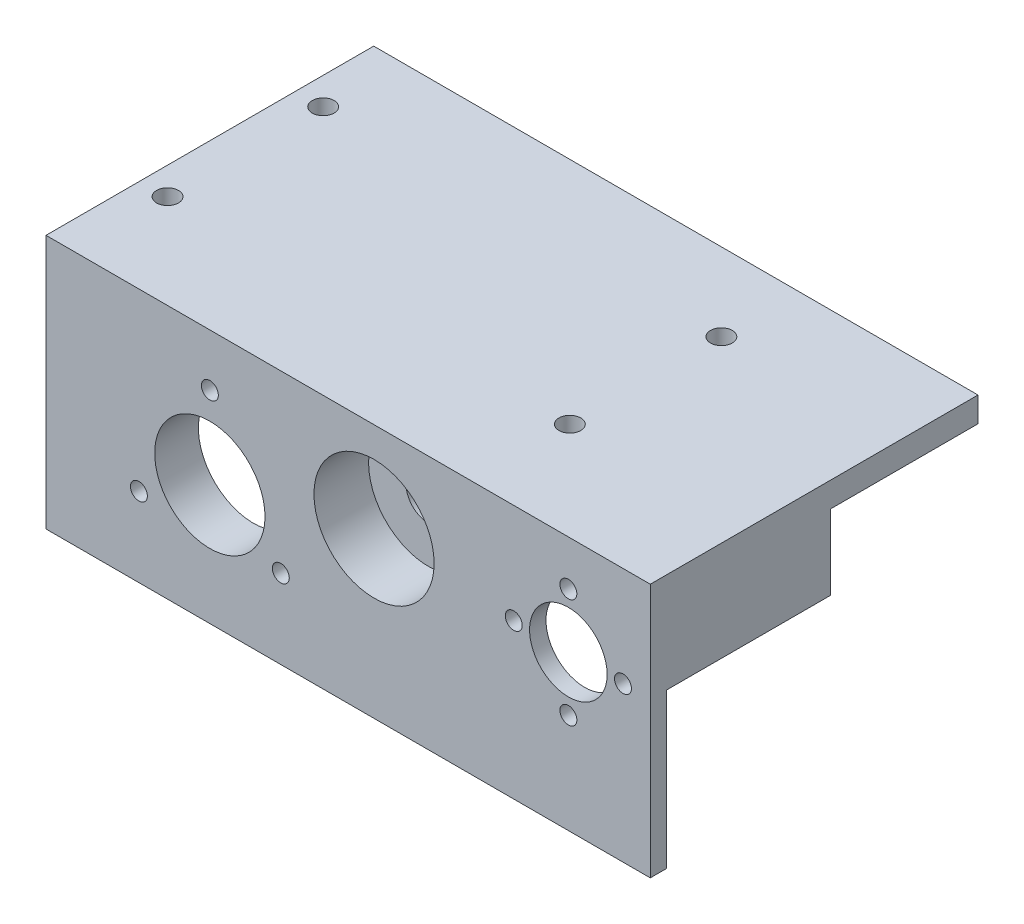
ISO-10303-21;
HEADER;
FILE_DESCRIPTION(('STEP AP214'),'2;1');
FILE_NAME('part.step','',(''),(''),'','','');
FILE_SCHEMA(('AUTOMOTIVE_DESIGN { 1 0 10303 214 1 1 1 1 }'));
ENDSEC;
DATA;
#1=APPLICATION_CONTEXT('core data for automotive mechanical design processes');
#2=APPLICATION_PROTOCOL_DEFINITION('international standard','automotive_design',2000,#1);
#3=PRODUCT_CONTEXT('',#1,'mechanical');
#4=PRODUCT('Part','Part','',(#3));
#5=PRODUCT_RELATED_PRODUCT_CATEGORY('part','',(#4));
#6=PRODUCT_DEFINITION_FORMATION('','',#4);
#7=PRODUCT_DEFINITION_CONTEXT('part definition',#1,'design');
#8=PRODUCT_DEFINITION('design','',#6,#7);
#9=PRODUCT_DEFINITION_SHAPE('','',#8);
#10=(LENGTH_UNIT() NAMED_UNIT(*) SI_UNIT(.MILLI.,.METRE.));
#11=(NAMED_UNIT(*) PLANE_ANGLE_UNIT() SI_UNIT($,.RADIAN.));
#12=(NAMED_UNIT(*) SI_UNIT($,.STERADIAN.) SOLID_ANGLE_UNIT());
#13=UNCERTAINTY_MEASURE_WITH_UNIT(LENGTH_MEASURE(1.E-05),#10,'distance_accuracy_value','');
#14=(GEOMETRIC_REPRESENTATION_CONTEXT(3) GLOBAL_UNCERTAINTY_ASSIGNED_CONTEXT((#13)) GLOBAL_UNIT_ASSIGNED_CONTEXT((#10,
#11,#12)) REPRESENTATION_CONTEXT('',''));
#15=CARTESIAN_POINT('',(0.,0.,0.));
#16=DIRECTION('',(0.,0.,1.));
#17=DIRECTION('',(1.,0.,0.));
#18=AXIS2_PLACEMENT_3D('',#15,#16,#17);
#19=CARTESIAN_POINT('',(60.0592660438776,30.0711771696162,60.));
#20=DIRECTION('',(0.,0.,-1.));
#21=DIRECTION('',(-1.,0.,0.));
#22=AXIS2_PLACEMENT_3D('',#19,#20,#21);
#23=CYLINDRICAL_SURFACE('',#22,11.);
#24=CARTESIAN_POINT('',(60.0592660438776,30.0711771696162,-7.00000000000001));
#25=DIRECTION('',(0.,0.,-1.));
#26=DIRECTION('',(-1.,0.,0.));
#27=AXIS2_PLACEMENT_3D('',#24,#25,#26);
#28=CIRCLE('',#27,11.);
#29=CARTESIAN_POINT('',(49.0592660438776,30.0711771696162,-7.00000000000001));
#30=VERTEX_POINT('',#29);
#31=EDGE_CURVE('E301',#30,#30,#28,.F.);
#32=ORIENTED_EDGE('',*,*,#31,.F.);
#33=EDGE_LOOP('',(#32));
#34=FACE_BOUND('',#33,.T.);
#35=CARTESIAN_POINT('',(60.0592660438776,30.0711771696162,3.));
#36=DIRECTION('',(0.,0.,1.));
#37=DIRECTION('',(1.,0.,0.));
#38=AXIS2_PLACEMENT_3D('',#35,#36,#37);
#39=CIRCLE('',#38,11.);
#40=CARTESIAN_POINT('',(71.0592660438776,30.0711771696162,3.));
#41=VERTEX_POINT('',#40);
#42=EDGE_CURVE('E321',#41,#41,#39,.T.);
#43=ORIENTED_EDGE('',*,*,#42,.T.);
#44=EDGE_LOOP('',(#43));
#45=FACE_BOUND('',#44,.T.);
#46=ADVANCED_FACE('F82',(#34,#45),#23,.F.);
#47=CARTESIAN_POINT('',(60.0592660438776,30.0711771696162,-7.));
#48=DIRECTION('',(0.,0.,1.));
#49=DIRECTION('',(1.,0.,0.));
#50=AXIS2_PLACEMENT_3D('',#47,#48,#49);
#51=CYLINDRICAL_SURFACE('',#50,13.);
#52=CARTESIAN_POINT('',(60.0592660438776,30.0711771696162,0.));
#53=DIRECTION('',(0.,0.,-1.));
#54=DIRECTION('',(-1.,0.,0.));
#55=AXIS2_PLACEMENT_3D('',#52,#53,#54);
#56=CIRCLE('',#55,13.);
#57=CARTESIAN_POINT('',(73.0592660438776,30.0711771696162,0.));
#58=VERTEX_POINT('',#57);
#59=CARTESIAN_POINT('',(55.9092660438776,17.7513760348575,0.));
#60=VERTEX_POINT('',#59);
#61=EDGE_CURVE('E311',#58,#60,#56,.T.);
#62=ORIENTED_EDGE('',*,*,#61,.T.);
#63=DIRECTION('',(0.,0.,1.));
#64=VECTOR('',#63,1.);
#65=CARTESIAN_POINT('',(55.9092660438776,17.7513760348575,-7.));
#66=LINE('',#65,#64);
#67=CARTESIAN_POINT('',(55.9092660438776,17.7513760348575,-5.));
#68=VERTEX_POINT('',#67);
#69=EDGE_CURVE('E100',#60,#68,#66,.F.);
#70=ORIENTED_EDGE('',*,*,#69,.T.);
#71=CARTESIAN_POINT('',(60.0592660438776,30.0711771696162,-5.));
#72=DIRECTION('',(0.,0.,-1.));
#73=DIRECTION('',(-1.,0.,0.));
#74=AXIS2_PLACEMENT_3D('',#71,#72,#73);
#75=CIRCLE('',#74,13.);
#76=CARTESIAN_POINT('',(49.5967813175664,22.3551928933423,-5.));
#77=VERTEX_POINT('',#76);
#78=EDGE_CURVE('E202',#68,#77,#75,.T.);
#79=ORIENTED_EDGE('',*,*,#78,.T.);
#80=DIRECTION('',(0.,0.,1.));
#81=VECTOR('',#80,1.);
#82=CARTESIAN_POINT('',(49.5967813175664,22.3551928933423,-28.5));
#83=LINE('',#82,#81);
#84=CARTESIAN_POINT('',(49.5967813175664,22.3551928933423,-30.));
#85=VERTEX_POINT('',#84);
#86=EDGE_CURVE('E278',#85,#77,#83,.T.);
#87=ORIENTED_EDGE('',*,*,#86,.F.);
#88=CARTESIAN_POINT('',(60.0592660438776,30.0711771696162,-30.));
#89=DIRECTION('',(0.,0.,-1.));
#90=DIRECTION('',(-1.,0.,0.));
#91=AXIS2_PLACEMENT_3D('',#88,#89,#90);
#92=CIRCLE('',#91,13.);
#93=CARTESIAN_POINT('',(73.0592660438776,30.0711771696162,-30.));
#94=VERTEX_POINT('',#93);
#95=EDGE_CURVE('E288',#94,#85,#92,.T.);
#96=ORIENTED_EDGE('',*,*,#95,.F.);
#97=DIRECTION('',(0.,0.,1.));
#98=VECTOR('',#97,1.);
#99=CARTESIAN_POINT('',(73.0592660438776,30.0711771696162,-7.));
#100=LINE('',#99,#98);
#101=EDGE_CURVE('E318',#94,#58,#100,.T.);
#102=ORIENTED_EDGE('',*,*,#101,.T.);
#103=EDGE_LOOP('',(#62,#70,#79,#87,#96,#102));
#104=FACE_BOUND('',#103,.T.);
#105=ADVANCED_FACE('F497',(#104),#51,.T.);
#106=CARTESIAN_POINT('',(47.0592660438776,0.,-7.));
#107=DIRECTION('',(-1.,0.,0.));
#108=DIRECTION('',(0.,0.,1.));
#109=AXIS2_PLACEMENT_3D('',#106,#107,#108);
#110=PLANE('',#109);
#111=DIRECTION('',(0.,-1.,0.));
#112=VECTOR('',#111,1.);
#113=CARTESIAN_POINT('',(47.0592660438776,0.,-5.));
#114=LINE('',#113,#112);
#115=CARTESIAN_POINT('',(47.0592660438776,42.,-5.));
#116=VERTEX_POINT('',#115);
#117=CARTESIAN_POINT('',(47.0592660438776,31.650981403164,-5.));
#118=VERTEX_POINT('',#117);
#119=EDGE_CURVE('E226',#116,#118,#114,.T.);
#120=ORIENTED_EDGE('',*,*,#119,.F.);
#121=DIRECTION('',(0.,0.,1.));
#122=VECTOR('',#121,1.);
#123=CARTESIAN_POINT('',(47.0592660438776,42.,-7.));
#124=LINE('',#123,#122);
#125=CARTESIAN_POINT('',(47.0592660438776,42.,-30.));
#126=VERTEX_POINT('',#125);
#127=EDGE_CURVE('E314',#126,#116,#124,.T.);
#128=ORIENTED_EDGE('',*,*,#127,.F.);
#129=DIRECTION('',(0.,1.,0.));
#130=VECTOR('',#129,1.);
#131=CARTESIAN_POINT('',(47.0592660438776,30.0711771696162,-30.));
#132=LINE('',#131,#130);
#133=CARTESIAN_POINT('',(47.0592660438776,31.650981403164,-30.));
#134=VERTEX_POINT('',#133);
#135=EDGE_CURVE('E285',#134,#126,#132,.T.);
#136=ORIENTED_EDGE('',*,*,#135,.F.);
#137=DIRECTION('',(0.,0.,1.));
#138=VECTOR('',#137,1.);
#139=CARTESIAN_POINT('',(47.0592660438776,31.650981403164,-57.));
#140=LINE('',#139,#138);
#141=EDGE_CURVE('E12',#134,#118,#140,.T.);
#142=ORIENTED_EDGE('',*,*,#141,.T.);
#143=EDGE_LOOP('',(#120,#128,#136,#142));
#144=FACE_BOUND('',#143,.T.);
#145=ADVANCED_FACE('F504',(#144),#110,.T.);
#146=CARTESIAN_POINT('',(60.0592660438776,30.0711771696162,-23.));
#147=DIRECTION('',(0.,0.,-1.));
#148=DIRECTION('',(-1.,0.,0.));
#149=AXIS2_PLACEMENT_3D('',#146,#147,#148);
#150=PLANE('',#149);
#151=CARTESIAN_POINT('',(60.0592660438776,30.0711771696162,-23.));
#152=DIRECTION('',(0.,0.,-1.));
#153=DIRECTION('',(-1.,0.,0.));
#154=AXIS2_PLACEMENT_3D('',#151,#152,#153);
#155=CIRCLE('',#154,4.15);
#156=CARTESIAN_POINT('',(55.9092660438776,30.0711771696162,-23.));
#157=VERTEX_POINT('',#156);
#158=EDGE_CURVE('E297',#157,#157,#155,.T.);
#159=ORIENTED_EDGE('',*,*,#158,.F.);
#160=EDGE_LOOP('',(#159));
#161=FACE_BOUND('',#160,.T.);
#162=CARTESIAN_POINT('',(60.0592660438776,30.0711771696162,-23.));
#163=DIRECTION('',(0.,0.,-1.));
#164=DIRECTION('',(-1.,0.,0.));
#165=AXIS2_PLACEMENT_3D('',#162,#163,#164);
#166=CIRCLE('',#165,11.);
#167=CARTESIAN_POINT('',(49.0592660438776,30.0711771696162,-23.));
#168=VERTEX_POINT('',#167);
#169=EDGE_CURVE('E92',#168,#168,#166,.F.);
#170=ORIENTED_EDGE('',*,*,#169,.F.);
#171=EDGE_LOOP('',(#170));
#172=FACE_BOUND('',#171,.T.);
#173=ADVANCED_FACE('F542',(#161,#172),#150,.T.);
#174=CARTESIAN_POINT('',(0.,0.,0.));
#175=DIRECTION('',(0.,0.,1.));
#176=DIRECTION('',(1.,0.,0.));
#177=AXIS2_PLACEMENT_3D('',#174,#175,#176);
#178=PLANE('',#177);
#179=DIRECTION('',(1.,0.,0.));
#180=VECTOR('',#179,1.);
#181=CARTESIAN_POINT('',(0.,0.,0.));
#182=LINE('',#181,#180);
#183=CARTESIAN_POINT('',(55.9092660438776,0.,0.));
#184=VERTEX_POINT('',#183);
#185=CARTESIAN_POINT('',(110.639208531659,0.,0.));
#186=VERTEX_POINT('',#185);
#187=EDGE_CURVE('E452',#184,#186,#182,.T.);
#188=ORIENTED_EDGE('',*,*,#187,.F.);
#189=DIRECTION('',(0.,-1.,0.));
#190=VECTOR('',#189,1.);
#191=CARTESIAN_POINT('',(55.9092660438776,0.,0.));
#192=LINE('',#191,#190);
#193=EDGE_CURVE('E108',#60,#184,#192,.T.);
#194=ORIENTED_EDGE('',*,*,#193,.F.);
#195=ORIENTED_EDGE('',*,*,#61,.F.);
#196=DIRECTION('',(1.,0.,0.));
#197=VECTOR('',#196,1.);
#198=CARTESIAN_POINT('',(0.,30.0711771696162,0.));
#199=LINE('',#198,#197);
#200=CARTESIAN_POINT('',(82.760430195426,30.0711771696162,0.));
#201=VERTEX_POINT('',#200);
#202=EDGE_CURVE('E308',#58,#201,#199,.T.);
#203=ORIENTED_EDGE('',*,*,#202,.T.);
#204=CARTESIAN_POINT('',(95.6392085316593,28.2999999999999,0.));
#205=DIRECTION('',(0.,0.,1.));
#206=DIRECTION('',(1.,0.,0.));
#207=AXIS2_PLACEMENT_3D('',#204,#205,#206);
#208=CIRCLE('',#207,13.);
#209=CARTESIAN_POINT('',(108.639208531659,28.2999999999964,0.));
#210=VERTEX_POINT('',#209);
#211=EDGE_CURVE('E338',#210,#201,#208,.T.);
#212=ORIENTED_EDGE('',*,*,#211,.F.);
#213=DIRECTION('',(-1.,0.,0.));
#214=VECTOR('',#213,1.);
#215=CARTESIAN_POINT('',(0.,28.2999999999964,0.));
#216=LINE('',#215,#214);
#217=CARTESIAN_POINT('',(110.639208531659,28.2999999999964,0.));
#218=VERTEX_POINT('',#217);
#219=EDGE_CURVE('E327',#218,#210,#216,.T.);
#220=ORIENTED_EDGE('',*,*,#219,.F.);
#221=DIRECTION('',(0.,-1.,0.));
#222=VECTOR('',#221,1.);
#223=CARTESIAN_POINT('',(110.639208531659,0.,0.));
#224=LINE('',#223,#222);
#225=EDGE_CURVE('E448',#218,#186,#224,.T.);
#226=ORIENTED_EDGE('',*,*,#225,.T.);
#227=EDGE_LOOP('',(#188,#194,#195,#203,#212,#220,#226));
#228=FACE_BOUND('',#227,.T.);
#229=CARTESIAN_POINT('',(85.6392085316545,28.2999999999964,0.));
#230=DIRECTION('',(0.,0.,1.));
#231=DIRECTION('',(1.,0.,0.));
#232=AXIS2_PLACEMENT_3D('',#229,#230,#231);
#233=CIRCLE('',#232,1.54999999999999);
#234=CARTESIAN_POINT('',(87.1892085316545,28.2999999999964,0.));
#235=VERTEX_POINT('',#234);
#236=EDGE_CURVE('E444',#235,#235,#233,.T.);
#237=ORIENTED_EDGE('',*,*,#236,.T.);
#238=EDGE_LOOP('',(#237));
#239=FACE_BOUND('',#238,.T.);
#240=CARTESIAN_POINT('',(95.6392085316592,38.3000000000002,0.));
#241=DIRECTION('',(0.,0.,1.));
#242=DIRECTION('',(1.,0.,0.));
#243=AXIS2_PLACEMENT_3D('',#240,#241,#242);
#244=CIRCLE('',#243,1.54999999999999);
#245=CARTESIAN_POINT('',(97.1892085316592,38.3000000000002,0.));
#246=VERTEX_POINT('',#245);
#247=EDGE_CURVE('E384',#246,#246,#244,.T.);
#248=ORIENTED_EDGE('',*,*,#247,.T.);
#249=EDGE_LOOP('',(#248));
#250=FACE_BOUND('',#249,.T.);
#251=CARTESIAN_POINT('',(105.639208531663,28.2999999999955,0.));
#252=DIRECTION('',(0.,0.,1.));
#253=DIRECTION('',(1.,0.,0.));
#254=AXIS2_PLACEMENT_3D('',#251,#252,#253);
#255=CIRCLE('',#254,1.54999999999999);
#256=CARTESIAN_POINT('',(107.189208531663,28.2999999999955,0.));
#257=VERTEX_POINT('',#256);
#258=EDGE_CURVE('E436',#257,#257,#255,.T.);
#259=ORIENTED_EDGE('',*,*,#258,.T.);
#260=EDGE_LOOP('',(#259));
#261=FACE_BOUND('',#260,.T.);
#262=CARTESIAN_POINT('',(95.6392085316593,28.2999999999999,0.));
#263=DIRECTION('',(0.,0.,1.));
#264=DIRECTION('',(1.,0.,0.));
#265=AXIS2_PLACEMENT_3D('',#262,#263,#264);
#266=CIRCLE('',#265,7.09999999999999);
#267=CARTESIAN_POINT('',(102.739208531659,28.2999999999999,0.));
#268=VERTEX_POINT('',#267);
#269=EDGE_CURVE('E440',#268,#268,#266,.T.);
#270=ORIENTED_EDGE('',*,*,#269,.T.);
#271=EDGE_LOOP('',(#270));
#272=FACE_BOUND('',#271,.T.);
#273=CARTESIAN_POINT('',(95.6392085316584,18.2999999999916,0.));
#274=DIRECTION('',(0.,0.,1.));
#275=DIRECTION('',(1.,0.,0.));
#276=AXIS2_PLACEMENT_3D('',#273,#274,#275);
#277=CIRCLE('',#276,1.54999999999999);
#278=CARTESIAN_POINT('',(97.1892085316584,18.2999999999916,0.));
#279=VERTEX_POINT('',#278);
#280=EDGE_CURVE('E390',#279,#279,#277,.T.);
#281=ORIENTED_EDGE('',*,*,#280,.T.);
#282=EDGE_LOOP('',(#281));
#283=FACE_BOUND('',#282,.T.);
#284=ADVANCED_FACE('F534',(#228,#239,#250,#261,#272,#283),#178,.F.);
#285=CARTESIAN_POINT('',(110.639208531659,42.,-57.));
#286=DIRECTION('',(0.,1.,0.));
#287=DIRECTION('',(0.,0.,1.));
#288=AXIS2_PLACEMENT_3D('',#285,#286,#287);
#289=PLANE('',#288);
#290=CARTESIAN_POINT('',(5.,42.,-14.25));
#291=DIRECTION('',(0.,-1.,0.));
#292=DIRECTION('',(0.,0.,-1.));
#293=AXIS2_PLACEMENT_3D('',#290,#291,#292);
#294=CIRCLE('',#293,2.);
#295=CARTESIAN_POINT('',(5.,42.,-16.25));
#296=VERTEX_POINT('',#295);
#297=EDGE_CURVE('E251',#296,#296,#294,.T.);
#298=ORIENTED_EDGE('',*,*,#297,.F.);
#299=EDGE_LOOP('',(#298));
#300=FACE_BOUND('',#299,.T.);
#301=CARTESIAN_POINT('',(77.9098481196518,42.,-42.75));
#302=DIRECTION('',(0.,-1.,0.));
#303=DIRECTION('',(0.,0.,-1.));
#304=AXIS2_PLACEMENT_3D('',#301,#302,#303);
#305=CIRCLE('',#304,2.);
#306=CARTESIAN_POINT('',(77.9098481196518,42.,-44.75));
#307=VERTEX_POINT('',#306);
#308=EDGE_CURVE('E256',#307,#307,#305,.T.);
#309=ORIENTED_EDGE('',*,*,#308,.F.);
#310=EDGE_LOOP('',(#309));
#311=FACE_BOUND('',#310,.T.);
#312=CARTESIAN_POINT('',(5.,42.,-42.75));
#313=DIRECTION('',(0.,-1.,0.));
#314=DIRECTION('',(0.,0.,-1.));
#315=AXIS2_PLACEMENT_3D('',#312,#313,#314);
#316=CIRCLE('',#315,2.);
#317=CARTESIAN_POINT('',(5.,42.,-44.75));
#318=VERTEX_POINT('',#317);
#319=EDGE_CURVE('E250',#318,#318,#316,.T.);
#320=ORIENTED_EDGE('',*,*,#319,.F.);
#321=EDGE_LOOP('',(#320));
#322=FACE_BOUND('',#321,.T.);
#323=ORIENTED_EDGE('',*,*,#127,.T.);
#324=DIRECTION('',(1.,0.,0.));
#325=VECTOR('',#324,1.);
#326=CARTESIAN_POINT('',(0.,42.,-5.));
#327=LINE('',#326,#325);
#328=CARTESIAN_POINT('',(0.,42.,-5.));
#329=VERTEX_POINT('',#328);
#330=EDGE_CURVE('E205',#329,#116,#327,.T.);
#331=ORIENTED_EDGE('',*,*,#330,.F.);
#332=DIRECTION('',(0.,0.,1.));
#333=VECTOR('',#332,1.);
#334=CARTESIAN_POINT('',(0.,42.,-57.));
#335=LINE('',#334,#333);
#336=CARTESIAN_POINT('',(0.,42.,-57.));
#337=VERTEX_POINT('',#336);
#338=EDGE_CURVE('E377',#337,#329,#335,.T.);
#339=ORIENTED_EDGE('',*,*,#338,.F.);
#340=DIRECTION('',(-1.,0.,0.));
#341=VECTOR('',#340,1.);
#342=CARTESIAN_POINT('',(110.639208531659,42.,-57.));
#343=LINE('',#342,#341);
#344=CARTESIAN_POINT('',(110.639208531659,42.,-57.));
#345=VERTEX_POINT('',#344);
#346=EDGE_CURVE('E357',#345,#337,#343,.T.);
#347=ORIENTED_EDGE('',*,*,#346,.F.);
#348=DIRECTION('',(0.,0.,1.));
#349=VECTOR('',#348,1.);
#350=CARTESIAN_POINT('',(110.639208531659,42.,-57.));
#351=LINE('',#350,#349);
#352=CARTESIAN_POINT('',(110.639208531659,42.,-30.));
#353=VERTEX_POINT('',#352);
#354=EDGE_CURVE('E381',#345,#353,#351,.T.);
#355=ORIENTED_EDGE('',*,*,#354,.T.);
#356=DIRECTION('',(1.,0.,0.));
#357=VECTOR('',#356,1.);
#358=CARTESIAN_POINT('',(0.,42.,-30.));
#359=LINE('',#358,#357);
#360=EDGE_CURVE('E333',#126,#353,#359,.T.);
#361=ORIENTED_EDGE('',*,*,#360,.F.);
#362=EDGE_LOOP('',(#323,#331,#339,#347,#355,#361));
#363=FACE_BOUND('',#362,.T.);
#364=ADVANCED_FACE('F530',(#300,#311,#322,#363),#289,.F.);
#365=CARTESIAN_POINT('',(110.639208531659,0.,3.));
#366=DIRECTION('',(1.,0.,0.));
#367=DIRECTION('',(0.,1.,0.));
#368=AXIS2_PLACEMENT_3D('',#365,#366,#367);
#369=PLANE('',#368);
#370=ORIENTED_EDGE('',*,*,#225,.F.);
#371=DIRECTION('',(0.,0.,1.));
#372=VECTOR('',#371,1.);
#373=CARTESIAN_POINT('',(110.639208531659,28.2999999999964,-30.));
#374=LINE('',#373,#372);
#375=CARTESIAN_POINT('',(110.639208531659,28.2999999999964,-30.));
#376=VERTEX_POINT('',#375);
#377=EDGE_CURVE('E345',#376,#218,#374,.T.);
#378=ORIENTED_EDGE('',*,*,#377,.F.);
#379=DIRECTION('',(0.,-1.,0.));
#380=VECTOR('',#379,1.);
#381=CARTESIAN_POINT('',(110.639208531659,0.,-30.));
#382=LINE('',#381,#380);
#383=EDGE_CURVE('E330',#353,#376,#382,.T.);
#384=ORIENTED_EDGE('',*,*,#383,.F.);
#385=ORIENTED_EDGE('',*,*,#354,.F.);
#386=DIRECTION('',(0.,-1.,0.));
#387=VECTOR('',#386,1.);
#388=CARTESIAN_POINT('',(110.639208531659,42.,-57.));
#389=LINE('',#388,#387);
#390=CARTESIAN_POINT('',(110.639208531659,46.57,-57.));
#391=VERTEX_POINT('',#390);
#392=EDGE_CURVE('E353',#391,#345,#389,.T.);
#393=ORIENTED_EDGE('',*,*,#392,.F.);
#394=DIRECTION('',(0.,0.,1.));
#395=VECTOR('',#394,1.);
#396=CARTESIAN_POINT('',(110.639208531659,46.57,-57.));
#397=LINE('',#396,#395);
#398=CARTESIAN_POINT('',(110.639208531659,46.57,3.));
#399=VERTEX_POINT('',#398);
#400=EDGE_CURVE('E366',#391,#399,#397,.T.);
#401=ORIENTED_EDGE('',*,*,#400,.T.);
#402=DIRECTION('',(0.,-1.,0.));
#403=VECTOR('',#402,1.);
#404=CARTESIAN_POINT('',(110.639208531659,0.,3.));
#405=LINE('',#404,#403);
#406=CARTESIAN_POINT('',(110.639208531659,0.,3.));
#407=VERTEX_POINT('',#406);
#408=EDGE_CURVE('E402',#399,#407,#405,.T.);
#409=ORIENTED_EDGE('',*,*,#408,.T.);
#410=DIRECTION('',(0.,0.,-1.));
#411=VECTOR('',#410,1.);
#412=CARTESIAN_POINT('',(110.639208531659,0.,3.));
#413=LINE('',#412,#411);
#414=EDGE_CURVE('E432',#407,#186,#413,.T.);
#415=ORIENTED_EDGE('',*,*,#414,.T.);
#416=EDGE_LOOP('',(#370,#378,#384,#385,#393,#401,#409,#415));
#417=FACE_BOUND('',#416,.T.);
#418=ADVANCED_FACE('F533',(#417),#369,.T.);
#419=CARTESIAN_POINT('',(0.,0.,3.));
#420=DIRECTION('',(-1.,0.,0.));
#421=DIRECTION('',(0.,-1.,0.));
#422=AXIS2_PLACEMENT_3D('',#419,#420,#421);
#423=PLANE('',#422);
#424=ORIENTED_EDGE('',*,*,#338,.T.);
#425=DIRECTION('',(0.,-1.,0.));
#426=VECTOR('',#425,1.);
#427=CARTESIAN_POINT('',(0.,0.,-5.));
#428=LINE('',#427,#426);
#429=CARTESIAN_POINT('',(0.,0.,-5.));
#430=VERTEX_POINT('',#429);
#431=EDGE_CURVE('E218',#329,#430,#428,.T.);
#432=ORIENTED_EDGE('',*,*,#431,.T.);
#433=DIRECTION('',(0.,0.,-1.));
#434=VECTOR('',#433,1.);
#435=CARTESIAN_POINT('',(0.,0.,3.));
#436=LINE('',#435,#434);
#437=CARTESIAN_POINT('',(0.,0.,3.));
#438=VERTEX_POINT('',#437);
#439=EDGE_CURVE('E216',#438,#430,#436,.T.);
#440=ORIENTED_EDGE('',*,*,#439,.F.);
#441=DIRECTION('',(0.,1.,0.));
#442=VECTOR('',#441,1.);
#443=CARTESIAN_POINT('',(0.,0.,3.));
#444=LINE('',#443,#442);
#445=CARTESIAN_POINT('',(0.,46.57,3.));
#446=VERTEX_POINT('',#445);
#447=EDGE_CURVE('E406',#438,#446,#444,.T.);
#448=ORIENTED_EDGE('',*,*,#447,.T.);
#449=DIRECTION('',(0.,0.,1.));
#450=VECTOR('',#449,1.);
#451=CARTESIAN_POINT('',(0.,46.57,-57.));
#452=LINE('',#451,#450);
#453=CARTESIAN_POINT('',(0.,46.57,-57.));
#454=VERTEX_POINT('',#453);
#455=EDGE_CURVE('E373',#454,#446,#452,.T.);
#456=ORIENTED_EDGE('',*,*,#455,.F.);
#457=DIRECTION('',(0.,1.,0.));
#458=VECTOR('',#457,1.);
#459=CARTESIAN_POINT('',(0.,42.,-57.));
#460=LINE('',#459,#458);
#461=EDGE_CURVE('E360',#337,#454,#460,.T.);
#462=ORIENTED_EDGE('',*,*,#461,.F.);
#463=EDGE_LOOP('',(#424,#432,#440,#448,#456,#462));
#464=FACE_BOUND('',#463,.T.);
#465=ADVANCED_FACE('F550',(#464),#423,.T.);
#466=CARTESIAN_POINT('',(30.,22.0000000000006,3.));
#467=DIRECTION('',(0.,0.,-1.));
#468=DIRECTION('',(-1.,0.,0.));
#469=AXIS2_PLACEMENT_3D('',#466,#467,#468);
#470=CYLINDRICAL_SURFACE('',#469,10.1);
#471=CARTESIAN_POINT('',(30.,22.0000000000006,3.));
#472=DIRECTION('',(0.,0.,1.));
#473=DIRECTION('',(1.,0.,0.));
#474=AXIS2_PLACEMENT_3D('',#471,#472,#473);
#475=CIRCLE('',#474,10.1);
#476=CARTESIAN_POINT('',(40.1,22.0000000000006,3.));
#477=VERTEX_POINT('',#476);
#478=EDGE_CURVE('E424',#477,#477,#475,.T.);
#479=ORIENTED_EDGE('',*,*,#478,.T.);
#480=EDGE_LOOP('',(#479));
#481=FACE_BOUND('',#480,.T.);
#482=CARTESIAN_POINT('',(30.,22.0000000000006,-5.));
#483=DIRECTION('',(0.,0.,1.));
#484=DIRECTION('',(1.,0.,0.));
#485=AXIS2_PLACEMENT_3D('',#482,#483,#484);
#486=CIRCLE('',#485,10.1);
#487=CARTESIAN_POINT('',(40.1,22.0000000000006,-5.));
#488=VERTEX_POINT('',#487);
#489=EDGE_CURVE('E246',#488,#488,#486,.T.);
#490=ORIENTED_EDGE('',*,*,#489,.F.);
#491=EDGE_LOOP('',(#490));
#492=FACE_BOUND('',#491,.T.);
#493=ADVANCED_FACE('F546',(#481,#492),#470,.F.);
#494=CARTESIAN_POINT('',(42.9903810567664,14.5000000000003,3.));
#495=DIRECTION('',(0.,0.,-1.));
#496=DIRECTION('',(-1.,0.,0.));
#497=AXIS2_PLACEMENT_3D('',#494,#495,#496);
#498=CYLINDRICAL_SURFACE('',#497,1.54999999999999);
#499=CARTESIAN_POINT('',(42.9903810567664,14.5000000000003,3.));
#500=DIRECTION('',(0.,0.,1.));
#501=DIRECTION('',(1.,0.,0.));
#502=AXIS2_PLACEMENT_3D('',#499,#500,#501);
#503=CIRCLE('',#502,1.54999999999999);
#504=CARTESIAN_POINT('',(44.5403810567664,14.5000000000003,3.));
#505=VERTEX_POINT('',#504);
#506=EDGE_CURVE('E420',#505,#505,#503,.T.);
#507=ORIENTED_EDGE('',*,*,#506,.T.);
#508=EDGE_LOOP('',(#507));
#509=FACE_BOUND('',#508,.T.);
#510=CARTESIAN_POINT('',(42.9903810567664,14.5000000000003,-5.));
#511=DIRECTION('',(0.,0.,1.));
#512=DIRECTION('',(1.,0.,0.));
#513=AXIS2_PLACEMENT_3D('',#510,#511,#512);
#514=CIRCLE('',#513,1.54999999999999);
#515=CARTESIAN_POINT('',(44.5403810567664,14.5000000000003,-5.));
#516=VERTEX_POINT('',#515);
#517=EDGE_CURVE('E242',#516,#516,#514,.T.);
#518=ORIENTED_EDGE('',*,*,#517,.F.);
#519=EDGE_LOOP('',(#518));
#520=FACE_BOUND('',#519,.T.);
#521=ADVANCED_FACE('F549',(#509,#520),#498,.F.);
#522=CARTESIAN_POINT('',(17.0096189432336,14.5000000000003,3.));
#523=DIRECTION('',(0.,0.,-1.));
#524=DIRECTION('',(-1.,0.,0.));
#525=AXIS2_PLACEMENT_3D('',#522,#523,#524);
#526=CYLINDRICAL_SURFACE('',#525,1.55000000000001);
#527=CARTESIAN_POINT('',(17.0096189432336,14.5000000000003,3.));
#528=DIRECTION('',(0.,0.,1.));
#529=DIRECTION('',(1.,0.,0.));
#530=AXIS2_PLACEMENT_3D('',#527,#528,#529);
#531=CIRCLE('',#530,1.55000000000001);
#532=CARTESIAN_POINT('',(18.5596189432336,14.5000000000003,3.));
#533=VERTEX_POINT('',#532);
#534=EDGE_CURVE('E416',#533,#533,#531,.T.);
#535=ORIENTED_EDGE('',*,*,#534,.T.);
#536=EDGE_LOOP('',(#535));
#537=FACE_BOUND('',#536,.T.);
#538=CARTESIAN_POINT('',(17.0096189432336,14.5000000000003,-5.));
#539=DIRECTION('',(0.,0.,1.));
#540=DIRECTION('',(1.,0.,0.));
#541=AXIS2_PLACEMENT_3D('',#538,#539,#540);
#542=CIRCLE('',#541,1.55000000000001);
#543=CARTESIAN_POINT('',(18.5596189432336,14.5000000000003,-5.));
#544=VERTEX_POINT('',#543);
#545=EDGE_CURVE('E238',#544,#544,#542,.T.);
#546=ORIENTED_EDGE('',*,*,#545,.F.);
#547=EDGE_LOOP('',(#546));
#548=FACE_BOUND('',#547,.T.);
#549=ADVANCED_FACE('F554',(#537,#548),#526,.F.);
#550=CARTESIAN_POINT('',(30.,37.,3.));
#551=DIRECTION('',(0.,0.,-1.));
#552=DIRECTION('',(-1.,0.,0.));
#553=AXIS2_PLACEMENT_3D('',#550,#551,#552);
#554=CYLINDRICAL_SURFACE('',#553,1.55);
#555=CARTESIAN_POINT('',(30.,37.,3.));
#556=DIRECTION('',(0.,0.,1.));
#557=DIRECTION('',(1.,0.,0.));
#558=AXIS2_PLACEMENT_3D('',#555,#556,#557);
#559=CIRCLE('',#558,1.55);
#560=CARTESIAN_POINT('',(31.55,37.,3.));
#561=VERTEX_POINT('',#560);
#562=EDGE_CURVE('E412',#561,#561,#559,.T.);
#563=ORIENTED_EDGE('',*,*,#562,.T.);
#564=EDGE_LOOP('',(#563));
#565=FACE_BOUND('',#564,.T.);
#566=CARTESIAN_POINT('',(30.,37.,-5.));
#567=DIRECTION('',(0.,0.,1.));
#568=DIRECTION('',(1.,0.,0.));
#569=AXIS2_PLACEMENT_3D('',#566,#567,#568);
#570=CIRCLE('',#569,1.55);
#571=CARTESIAN_POINT('',(31.55,37.,-5.));
#572=VERTEX_POINT('',#571);
#573=EDGE_CURVE('E234',#572,#572,#570,.T.);
#574=ORIENTED_EDGE('',*,*,#573,.F.);
#575=EDGE_LOOP('',(#574));
#576=FACE_BOUND('',#575,.T.);
#577=ADVANCED_FACE('F558',(#565,#576),#554,.F.);
#578=CARTESIAN_POINT('',(0.,0.,3.));
#579=DIRECTION('',(0.,1.,0.));
#580=DIRECTION('',(0.,0.,1.));
#581=AXIS2_PLACEMENT_3D('',#578,#579,#580);
#582=PLANE('',#581);
#583=ORIENTED_EDGE('',*,*,#439,.T.);
#584=DIRECTION('',(1.,0.,0.));
#585=VECTOR('',#584,1.);
#586=CARTESIAN_POINT('',(0.,0.,-5.));
#587=LINE('',#586,#585);
#588=CARTESIAN_POINT('',(55.9092660438776,0.,-5.));
#589=VERTEX_POINT('',#588);
#590=EDGE_CURVE('E199',#430,#589,#587,.T.);
#591=ORIENTED_EDGE('',*,*,#590,.T.);
#592=DIRECTION('',(0.,0.,-1.));
#593=VECTOR('',#592,1.);
#594=CARTESIAN_POINT('',(55.9092660438776,0.,0.));
#595=LINE('',#594,#593);
#596=EDGE_CURVE('E208',#184,#589,#595,.T.);
#597=ORIENTED_EDGE('',*,*,#596,.F.);
#598=ORIENTED_EDGE('',*,*,#187,.T.);
#599=ORIENTED_EDGE('',*,*,#414,.F.);
#600=DIRECTION('',(1.,0.,0.));
#601=VECTOR('',#600,1.);
#602=CARTESIAN_POINT('',(0.,0.,3.));
#603=LINE('',#602,#601);
#604=EDGE_CURVE('E409',#438,#407,#603,.T.);
#605=ORIENTED_EDGE('',*,*,#604,.F.);
#606=EDGE_LOOP('',(#583,#591,#597,#598,#599,#605));
#607=FACE_BOUND('',#606,.T.);
#608=ADVANCED_FACE('F214',(#607),#582,.F.);
#609=CARTESIAN_POINT('',(85.6392085316545,28.2999999999964,3.));
#610=DIRECTION('',(0.,0.,-1.));
#611=DIRECTION('',(-1.,0.,0.));
#612=AXIS2_PLACEMENT_3D('',#609,#610,#611);
#613=CYLINDRICAL_SURFACE('',#612,1.54999999999999);
#614=CARTESIAN_POINT('',(85.6392085316545,28.2999999999964,3.));
#615=DIRECTION('',(0.,0.,1.));
#616=DIRECTION('',(1.,0.,0.));
#617=AXIS2_PLACEMENT_3D('',#614,#615,#616);
#618=CIRCLE('',#617,1.54999999999999);
#619=CARTESIAN_POINT('',(87.1892085316545,28.2999999999964,3.));
#620=VERTEX_POINT('',#619);
#621=EDGE_CURVE('E398',#620,#620,#618,.T.);
#622=ORIENTED_EDGE('',*,*,#621,.T.);
#623=EDGE_LOOP('',(#622));
#624=FACE_BOUND('',#623,.T.);
#625=ORIENTED_EDGE('',*,*,#236,.F.);
#626=EDGE_LOOP('',(#625));
#627=FACE_BOUND('',#626,.T.);
#628=ADVANCED_FACE('F565',(#624,#627),#613,.F.);
#629=CARTESIAN_POINT('',(95.6392085316593,28.2999999999999,3.));
#630=DIRECTION('',(0.,0.,-1.));
#631=DIRECTION('',(-1.,0.,0.));
#632=AXIS2_PLACEMENT_3D('',#629,#630,#631);
#633=CYLINDRICAL_SURFACE('',#632,7.09999999999999);
#634=CARTESIAN_POINT('',(95.6392085316593,28.2999999999999,3.));
#635=DIRECTION('',(0.,0.,1.));
#636=DIRECTION('',(1.,0.,0.));
#637=AXIS2_PLACEMENT_3D('',#634,#635,#636);
#638=CIRCLE('',#637,7.09999999999999);
#639=CARTESIAN_POINT('',(102.739208531659,28.2999999999999,3.));
#640=VERTEX_POINT('',#639);
#641=EDGE_CURVE('E394',#640,#640,#638,.T.);
#642=ORIENTED_EDGE('',*,*,#641,.T.);
#643=EDGE_LOOP('',(#642));
#644=FACE_BOUND('',#643,.T.);
#645=ORIENTED_EDGE('',*,*,#269,.F.);
#646=EDGE_LOOP('',(#645));
#647=FACE_BOUND('',#646,.T.);
#648=ADVANCED_FACE('F574',(#644,#647),#633,.F.);
#649=CARTESIAN_POINT('',(105.639208531663,28.2999999999955,3.));
#650=DIRECTION('',(0.,0.,-1.));
#651=DIRECTION('',(-1.,0.,0.));
#652=AXIS2_PLACEMENT_3D('',#649,#650,#651);
#653=CYLINDRICAL_SURFACE('',#652,1.54999999999999);
#654=CARTESIAN_POINT('',(105.639208531663,28.2999999999955,3.));
#655=DIRECTION('',(0.,0.,1.));
#656=DIRECTION('',(1.,0.,0.));
#657=AXIS2_PLACEMENT_3D('',#654,#655,#656);
#658=CIRCLE('',#657,1.54999999999999);
#659=CARTESIAN_POINT('',(107.189208531663,28.2999999999955,3.));
#660=VERTEX_POINT('',#659);
#661=EDGE_CURVE('E389',#660,#660,#658,.T.);
#662=ORIENTED_EDGE('',*,*,#661,.T.);
#663=EDGE_LOOP('',(#662));
#664=FACE_BOUND('',#663,.T.);
#665=ORIENTED_EDGE('',*,*,#258,.F.);
#666=EDGE_LOOP('',(#665));
#667=FACE_BOUND('',#666,.T.);
#668=ADVANCED_FACE('F577',(#664,#667),#653,.F.);
#669=CARTESIAN_POINT('',(95.6392085316592,38.3000000000002,3.));
#670=DIRECTION('',(0.,0.,-1.));
#671=DIRECTION('',(-1.,0.,0.));
#672=AXIS2_PLACEMENT_3D('',#669,#670,#671);
#673=CYLINDRICAL_SURFACE('',#672,1.54999999999999);
#674=CARTESIAN_POINT('',(95.6392085316592,38.3000000000002,3.));
#675=DIRECTION('',(0.,0.,1.));
#676=DIRECTION('',(1.,0.,0.));
#677=AXIS2_PLACEMENT_3D('',#674,#675,#676);
#678=CIRCLE('',#677,1.54999999999999);
#679=CARTESIAN_POINT('',(97.1892085316592,38.3000000000002,3.));
#680=VERTEX_POINT('',#679);
#681=EDGE_CURVE('E385',#680,#680,#678,.T.);
#682=ORIENTED_EDGE('',*,*,#681,.T.);
#683=EDGE_LOOP('',(#682));
#684=FACE_BOUND('',#683,.T.);
#685=ORIENTED_EDGE('',*,*,#247,.F.);
#686=EDGE_LOOP('',(#685));
#687=FACE_BOUND('',#686,.T.);
#688=ADVANCED_FACE('F84',(#684,#687),#673,.F.);
#689=CARTESIAN_POINT('',(95.6392085316584,18.2999999999916,3.));
#690=DIRECTION('',(0.,0.,-1.));
#691=DIRECTION('',(-1.,0.,0.));
#692=AXIS2_PLACEMENT_3D('',#689,#690,#691);
#693=CYLINDRICAL_SURFACE('',#692,1.54999999999999);
#694=CARTESIAN_POINT('',(95.6392085316584,18.2999999999916,3.));
#695=DIRECTION('',(0.,0.,1.));
#696=DIRECTION('',(1.,0.,0.));
#697=AXIS2_PLACEMENT_3D('',#694,#695,#696);
#698=CIRCLE('',#697,1.54999999999999);
#699=CARTESIAN_POINT('',(97.1892085316584,18.2999999999916,3.));
#700=VERTEX_POINT('',#699);
#701=EDGE_CURVE('E428',#700,#700,#698,.T.);
#702=ORIENTED_EDGE('',*,*,#701,.T.);
#703=EDGE_LOOP('',(#702));
#704=FACE_BOUND('',#703,.T.);
#705=ORIENTED_EDGE('',*,*,#280,.F.);
#706=EDGE_LOOP('',(#705));
#707=FACE_BOUND('',#706,.T.);
#708=ADVANCED_FACE('F538',(#704,#707),#693,.F.);
#709=CARTESIAN_POINT('',(0.,0.,3.));
#710=DIRECTION('',(0.,0.,1.));
#711=DIRECTION('',(1.,0.,0.));
#712=AXIS2_PLACEMENT_3D('',#709,#710,#711);
#713=PLANE('',#712);
#714=ORIENTED_EDGE('',*,*,#42,.F.);
#715=EDGE_LOOP('',(#714));
#716=FACE_BOUND('',#715,.T.);
#717=ORIENTED_EDGE('',*,*,#681,.F.);
#718=EDGE_LOOP('',(#717));
#719=FACE_BOUND('',#718,.T.);
#720=ORIENTED_EDGE('',*,*,#661,.F.);
#721=EDGE_LOOP('',(#720));
#722=FACE_BOUND('',#721,.T.);
#723=ORIENTED_EDGE('',*,*,#641,.F.);
#724=EDGE_LOOP('',(#723));
#725=FACE_BOUND('',#724,.T.);
#726=ORIENTED_EDGE('',*,*,#621,.F.);
#727=EDGE_LOOP('',(#726));
#728=FACE_BOUND('',#727,.T.);
#729=ORIENTED_EDGE('',*,*,#408,.F.);
#730=DIRECTION('',(1.,0.,0.));
#731=VECTOR('',#730,1.);
#732=CARTESIAN_POINT('',(110.639208531659,46.57,3.));
#733=LINE('',#732,#731);
#734=EDGE_CURVE('E349',#446,#399,#733,.T.);
#735=ORIENTED_EDGE('',*,*,#734,.F.);
#736=ORIENTED_EDGE('',*,*,#447,.F.);
#737=ORIENTED_EDGE('',*,*,#604,.T.);
#738=EDGE_LOOP('',(#729,#735,#736,#737));
#739=FACE_BOUND('',#738,.T.);
#740=ORIENTED_EDGE('',*,*,#562,.F.);
#741=EDGE_LOOP('',(#740));
#742=FACE_BOUND('',#741,.T.);
#743=ORIENTED_EDGE('',*,*,#534,.F.);
#744=EDGE_LOOP('',(#743));
#745=FACE_BOUND('',#744,.T.);
#746=ORIENTED_EDGE('',*,*,#506,.F.);
#747=EDGE_LOOP('',(#746));
#748=FACE_BOUND('',#747,.T.);
#749=ORIENTED_EDGE('',*,*,#478,.F.);
#750=EDGE_LOOP('',(#749));
#751=FACE_BOUND('',#750,.T.);
#752=ORIENTED_EDGE('',*,*,#701,.F.);
#753=EDGE_LOOP('',(#752));
#754=FACE_BOUND('',#753,.T.);
#755=ADVANCED_FACE('F529',(#716,#719,#722,#725,#728,#739,#742,#745,#748,#751,#754),#713,.T.);
#756=CARTESIAN_POINT('',(110.639208531659,46.57,-57.));
#757=DIRECTION('',(0.,-1.,0.));
#758=DIRECTION('',(0.,0.,-1.));
#759=AXIS2_PLACEMENT_3D('',#756,#757,#758);
#760=PLANE('',#759);
#761=CARTESIAN_POINT('',(5.,46.57,-14.25));
#762=DIRECTION('',(0.,-1.,0.));
#763=DIRECTION('',(0.,0.,-1.));
#764=AXIS2_PLACEMENT_3D('',#761,#762,#763);
#765=CIRCLE('',#764,2.);
#766=CARTESIAN_POINT('',(5.,46.57,-16.25));
#767=VERTEX_POINT('',#766);
#768=EDGE_CURVE('E86',#767,#767,#765,.T.);
#769=ORIENTED_EDGE('',*,*,#768,.T.);
#770=EDGE_LOOP('',(#769));
#771=FACE_BOUND('',#770,.T.);
#772=CARTESIAN_POINT('',(77.9098481196518,46.57,-42.75));
#773=DIRECTION('',(0.,-1.,0.));
#774=DIRECTION('',(0.,0.,-1.));
#775=AXIS2_PLACEMENT_3D('',#772,#773,#774);
#776=CIRCLE('',#775,2.);
#777=CARTESIAN_POINT('',(77.9098481196518,46.57,-44.75));
#778=VERTEX_POINT('',#777);
#779=EDGE_CURVE('E471',#778,#778,#776,.T.);
#780=ORIENTED_EDGE('',*,*,#779,.T.);
#781=EDGE_LOOP('',(#780));
#782=FACE_BOUND('',#781,.T.);
#783=CARTESIAN_POINT('',(5.,46.57,-42.75));
#784=DIRECTION('',(0.,-1.,0.));
#785=DIRECTION('',(0.,0.,-1.));
#786=AXIS2_PLACEMENT_3D('',#783,#784,#785);
#787=CIRCLE('',#786,2.);
#788=CARTESIAN_POINT('',(5.,46.57,-44.75));
#789=VERTEX_POINT('',#788);
#790=EDGE_CURVE('E255',#789,#789,#787,.T.);
#791=ORIENTED_EDGE('',*,*,#790,.T.);
#792=EDGE_LOOP('',(#791));
#793=FACE_BOUND('',#792,.T.);
#794=CARTESIAN_POINT('',(77.9098481196518,46.57,-15.));
#795=DIRECTION('',(0.,-1.,0.));
#796=DIRECTION('',(0.,0.,-1.));
#797=AXIS2_PLACEMENT_3D('',#794,#795,#796);
#798=CIRCLE('',#797,2.);
#799=CARTESIAN_POINT('',(77.9098481196518,46.57,-17.));
#800=VERTEX_POINT('',#799);
#801=EDGE_CURVE('E263',#800,#800,#798,.T.);
#802=ORIENTED_EDGE('',*,*,#801,.T.);
#803=EDGE_LOOP('',(#802));
#804=FACE_BOUND('',#803,.T.);
#805=ORIENTED_EDGE('',*,*,#734,.T.);
#806=ORIENTED_EDGE('',*,*,#400,.F.);
#807=DIRECTION('',(1.,0.,0.));
#808=VECTOR('',#807,1.);
#809=CARTESIAN_POINT('',(110.639208531659,46.57,-57.));
#810=LINE('',#809,#808);
#811=EDGE_CURVE('E363',#454,#391,#810,.T.);
#812=ORIENTED_EDGE('',*,*,#811,.F.);
#813=ORIENTED_EDGE('',*,*,#455,.T.);
#814=EDGE_LOOP('',(#805,#806,#812,#813));
#815=FACE_BOUND('',#814,.T.);
#816=ADVANCED_FACE('F480',(#771,#782,#793,#804,#815),#760,.F.);
#817=CARTESIAN_POINT('',(0.,0.,-57.));
#818=DIRECTION('',(0.,0.,1.));
#819=DIRECTION('',(1.,0.,0.));
#820=AXIS2_PLACEMENT_3D('',#817,#818,#819);
#821=PLANE('',#820);
#822=ORIENTED_EDGE('',*,*,#392,.T.);
#823=ORIENTED_EDGE('',*,*,#346,.T.);
#824=ORIENTED_EDGE('',*,*,#461,.T.);
#825=ORIENTED_EDGE('',*,*,#811,.T.);
#826=EDGE_LOOP('',(#822,#823,#824,#825));
#827=FACE_BOUND('',#826,.T.);
#828=ADVANCED_FACE('F522',(#827),#821,.F.);
#829=CARTESIAN_POINT('',(95.6392085316593,28.2999999999999,-30.));
#830=DIRECTION('',(0.,0.,1.));
#831=DIRECTION('',(1.,0.,0.));
#832=AXIS2_PLACEMENT_3D('',#829,#830,#831);
#833=CYLINDRICAL_SURFACE('',#832,13.);
#834=ORIENTED_EDGE('',*,*,#211,.T.);
#835=DIRECTION('',(0.,0.,1.));
#836=VECTOR('',#835,1.);
#837=CARTESIAN_POINT('',(82.760430195426,30.0711771696162,-30.));
#838=LINE('',#837,#836);
#839=CARTESIAN_POINT('',(82.760430195426,30.0711771696162,-30.));
#840=VERTEX_POINT('',#839);
#841=EDGE_CURVE('E267',#201,#840,#838,.F.);
#842=ORIENTED_EDGE('',*,*,#841,.T.);
#843=CARTESIAN_POINT('',(95.6392085316593,28.2999999999999,-30.));
#844=DIRECTION('',(0.,0.,1.));
#845=DIRECTION('',(1.,0.,0.));
#846=AXIS2_PLACEMENT_3D('',#843,#844,#845);
#847=CIRCLE('',#846,13.);
#848=CARTESIAN_POINT('',(108.639208531659,28.2999999999964,-30.));
#849=VERTEX_POINT('',#848);
#850=EDGE_CURVE('E322',#849,#840,#847,.T.);
#851=ORIENTED_EDGE('',*,*,#850,.F.);
#852=DIRECTION('',(0.,0.,1.));
#853=VECTOR('',#852,1.);
#854=CARTESIAN_POINT('',(108.639208531659,28.2999999999964,-30.));
#855=LINE('',#854,#853);
#856=EDGE_CURVE('E337',#849,#210,#855,.T.);
#857=ORIENTED_EDGE('',*,*,#856,.T.);
#858=EDGE_LOOP('',(#834,#842,#851,#857));
#859=FACE_BOUND('',#858,.T.);
#860=ADVANCED_FACE('F518',(#859),#833,.F.);
#861=CARTESIAN_POINT('',(0.,28.2999999999964,-30.));
#862=DIRECTION('',(0.,1.,0.));
#863=DIRECTION('',(-1.,0.,0.));
#864=AXIS2_PLACEMENT_3D('',#861,#862,#863);
#865=PLANE('',#864);
#866=ORIENTED_EDGE('',*,*,#219,.T.);
#867=ORIENTED_EDGE('',*,*,#856,.F.);
#868=DIRECTION('',(-1.,0.,0.));
#869=VECTOR('',#868,1.);
#870=CARTESIAN_POINT('',(0.,28.2999999999964,-30.));
#871=LINE('',#870,#869);
#872=EDGE_CURVE('E326',#376,#849,#871,.T.);
#873=ORIENTED_EDGE('',*,*,#872,.F.);
#874=ORIENTED_EDGE('',*,*,#377,.T.);
#875=EDGE_LOOP('',(#866,#867,#873,#874));
#876=FACE_BOUND('',#875,.T.);
#877=ADVANCED_FACE('F514',(#876),#865,.F.);
#878=CARTESIAN_POINT('',(0.,0.,-30.));
#879=DIRECTION('',(0.,0.,1.));
#880=DIRECTION('',(1.,0.,0.));
#881=AXIS2_PLACEMENT_3D('',#878,#879,#880);
#882=PLANE('',#881);
#883=ORIENTED_EDGE('',*,*,#850,.T.);
#884=DIRECTION('',(-1.,0.,0.));
#885=VECTOR('',#884,1.);
#886=CARTESIAN_POINT('',(60.0592660438776,30.0711771696162,-30.));
#887=LINE('',#886,#885);
#888=EDGE_CURVE('E292',#840,#94,#887,.T.);
#889=ORIENTED_EDGE('',*,*,#888,.T.);
#890=ORIENTED_EDGE('',*,*,#95,.T.);
#891=CARTESIAN_POINT('',(30.,22.0000000000006,-30.));
#892=DIRECTION('',(0.,0.,1.));
#893=DIRECTION('',(1.,0.,0.));
#894=AXIS2_PLACEMENT_3D('',#891,#892,#893);
#895=CIRCLE('',#894,19.6);
#896=EDGE_CURVE('E275',#134,#85,#895,.F.);
#897=ORIENTED_EDGE('',*,*,#896,.F.);
#898=ORIENTED_EDGE('',*,*,#135,.T.);
#899=ORIENTED_EDGE('',*,*,#360,.T.);
#900=ORIENTED_EDGE('',*,*,#383,.T.);
#901=ORIENTED_EDGE('',*,*,#872,.T.);
#902=EDGE_LOOP('',(#883,#889,#890,#897,#898,#899,#900,#901));
#903=FACE_BOUND('',#902,.T.);
#904=CARTESIAN_POINT('',(60.0592660438776,30.0711771696162,-30.));
#905=DIRECTION('',(0.,0.,-1.));
#906=DIRECTION('',(-1.,0.,0.));
#907=AXIS2_PLACEMENT_3D('',#904,#905,#906);
#908=CIRCLE('',#907,11.);
#909=CARTESIAN_POINT('',(49.0592660438776,30.0711771696162,-30.));
#910=VERTEX_POINT('',#909);
#911=EDGE_CURVE('E281',#910,#910,#908,.T.);
#912=ORIENTED_EDGE('',*,*,#911,.F.);
#913=EDGE_LOOP('',(#912));
#914=FACE_BOUND('',#913,.T.);
#915=ADVANCED_FACE('F511',(#903,#914),#882,.F.);
#916=CARTESIAN_POINT('',(0.,30.0711771696162,-7.));
#917=DIRECTION('',(0.,-1.,0.));
#918=DIRECTION('',(1.,0.,0.));
#919=AXIS2_PLACEMENT_3D('',#916,#917,#918);
#920=PLANE('',#919);
#921=CARTESIAN_POINT('',(77.9098481196518,30.0711771696162,-15.));
#922=DIRECTION('',(0.,-1.,0.));
#923=DIRECTION('',(0.,0.,-1.));
#924=AXIS2_PLACEMENT_3D('',#921,#922,#923);
#925=CIRCLE('',#924,2.);
#926=CARTESIAN_POINT('',(77.9098481196518,30.0711771696162,-17.));
#927=VERTEX_POINT('',#926);
#928=EDGE_CURVE('E268',#927,#927,#925,.T.);
#929=ORIENTED_EDGE('',*,*,#928,.F.);
#930=EDGE_LOOP('',(#929));
#931=FACE_BOUND('',#930,.T.);
#932=ORIENTED_EDGE('',*,*,#202,.F.);
#933=ORIENTED_EDGE('',*,*,#101,.F.);
#934=ORIENTED_EDGE('',*,*,#888,.F.);
#935=ORIENTED_EDGE('',*,*,#841,.F.);
#936=EDGE_LOOP('',(#932,#933,#934,#935));
#937=FACE_BOUND('',#936,.T.);
#938=ADVANCED_FACE('F510',(#931,#937),#920,.T.);
#939=CARTESIAN_POINT('',(60.0592660438776,30.0711771696162,-7.));
#940=DIRECTION('',(0.,0.,-1.));
#941=DIRECTION('',(-1.,0.,0.));
#942=AXIS2_PLACEMENT_3D('',#939,#940,#941);
#943=PLANE('',#942);
#944=CARTESIAN_POINT('',(60.0592660438776,30.0711771696162,-7.));
#945=DIRECTION('',(0.,0.,-1.));
#946=DIRECTION('',(-1.,0.,0.));
#947=AXIS2_PLACEMENT_3D('',#944,#945,#946);
#948=CIRCLE('',#947,4.15);
#949=CARTESIAN_POINT('',(55.9092660438776,30.0711771696162,-7.));
#950=VERTEX_POINT('',#949);
#951=EDGE_CURVE('E296',#950,#950,#948,.T.);
#952=ORIENTED_EDGE('',*,*,#951,.T.);
#953=EDGE_LOOP('',(#952));
#954=FACE_BOUND('',#953,.T.);
#955=ORIENTED_EDGE('',*,*,#31,.T.);
#956=EDGE_LOOP('',(#955));
#957=FACE_BOUND('',#956,.T.);
#958=ADVANCED_FACE('F659',(#954,#957),#943,.F.);
#959=CARTESIAN_POINT('',(60.0592660438776,30.0711771696162,-23.));
#960=DIRECTION('',(0.,0.,1.));
#961=DIRECTION('',(1.,0.,0.));
#962=AXIS2_PLACEMENT_3D('',#959,#960,#961);
#963=CYLINDRICAL_SURFACE('',#962,4.15);
#964=ORIENTED_EDGE('',*,*,#158,.T.);
#965=EDGE_LOOP('',(#964));
#966=FACE_BOUND('',#965,.T.);
#967=ORIENTED_EDGE('',*,*,#951,.F.);
#968=EDGE_LOOP('',(#967));
#969=FACE_BOUND('',#968,.T.);
#970=ADVANCED_FACE('F664',(#966,#969),#963,.F.);
#971=CARTESIAN_POINT('',(60.0592660438776,30.0711771696162,-30.));
#972=DIRECTION('',(0.,0.,1.));
#973=DIRECTION('',(1.,0.,0.));
#974=AXIS2_PLACEMENT_3D('',#971,#972,#973);
#975=CYLINDRICAL_SURFACE('',#974,11.);
#976=ORIENTED_EDGE('',*,*,#911,.T.);
#977=EDGE_LOOP('',(#976));
#978=FACE_BOUND('',#977,.T.);
#979=ORIENTED_EDGE('',*,*,#169,.T.);
#980=EDGE_LOOP('',(#979));
#981=FACE_BOUND('',#980,.T.);
#982=ADVANCED_FACE('F679',(#978,#981),#975,.F.);
#983=CARTESIAN_POINT('',(30.,22.0000000000006,-57.));
#984=DIRECTION('',(0.,0.,1.));
#985=DIRECTION('',(1.,0.,0.));
#986=AXIS2_PLACEMENT_3D('',#983,#984,#985);
#987=CYLINDRICAL_SURFACE('',#986,19.6);
#988=CARTESIAN_POINT('',(30.,22.0000000000006,-5.));
#989=DIRECTION('',(0.,0.,-1.));
#990=DIRECTION('',(-1.,0.,0.));
#991=AXIS2_PLACEMENT_3D('',#988,#989,#990);
#992=CIRCLE('',#991,19.6);
#993=EDGE_CURVE('E212',#118,#77,#992,.T.);
#994=ORIENTED_EDGE('',*,*,#993,.F.);
#995=ORIENTED_EDGE('',*,*,#141,.F.);
#996=ORIENTED_EDGE('',*,*,#896,.T.);
#997=ORIENTED_EDGE('',*,*,#86,.T.);
#998=EDGE_LOOP('',(#994,#995,#996,#997));
#999=FACE_BOUND('',#998,.T.);
#1000=ADVANCED_FACE('F651',(#999),#987,.F.);
#1001=CARTESIAN_POINT('',(77.9098481196518,46.57,-15.));
#1002=DIRECTION('',(0.,-1.,0.));
#1003=DIRECTION('',(0.,0.,-1.));
#1004=AXIS2_PLACEMENT_3D('',#1001,#1002,#1003);
#1005=CYLINDRICAL_SURFACE('',#1004,2.);
#1006=ORIENTED_EDGE('',*,*,#801,.F.);
#1007=EDGE_LOOP('',(#1006));
#1008=FACE_BOUND('',#1007,.T.);
#1009=ORIENTED_EDGE('',*,*,#928,.T.);
#1010=EDGE_LOOP('',(#1009));
#1011=FACE_BOUND('',#1010,.T.);
#1012=ADVANCED_FACE('F669',(#1008,#1011),#1005,.F.);
#1013=CARTESIAN_POINT('',(5.,49.,-42.75));
#1014=DIRECTION('',(0.,-1.,0.));
#1015=DIRECTION('',(0.,0.,-1.));
#1016=AXIS2_PLACEMENT_3D('',#1013,#1014,#1015);
#1017=CYLINDRICAL_SURFACE('',#1016,2.);
#1018=ORIENTED_EDGE('',*,*,#319,.T.);
#1019=EDGE_LOOP('',(#1018));
#1020=FACE_BOUND('',#1019,.T.);
#1021=ORIENTED_EDGE('',*,*,#790,.F.);
#1022=EDGE_LOOP('',(#1021));
#1023=FACE_BOUND('',#1022,.T.);
#1024=ADVANCED_FACE('F493',(#1020,#1023),#1017,.F.);
#1025=CARTESIAN_POINT('',(77.9098481196518,49.,-42.75));
#1026=DIRECTION('',(0.,-1.,0.));
#1027=DIRECTION('',(0.,0.,-1.));
#1028=AXIS2_PLACEMENT_3D('',#1025,#1026,#1027);
#1029=CYLINDRICAL_SURFACE('',#1028,2.);
#1030=ORIENTED_EDGE('',*,*,#308,.T.);
#1031=EDGE_LOOP('',(#1030));
#1032=FACE_BOUND('',#1031,.T.);
#1033=ORIENTED_EDGE('',*,*,#779,.F.);
#1034=EDGE_LOOP('',(#1033));
#1035=FACE_BOUND('',#1034,.T.);
#1036=ADVANCED_FACE('F484',(#1032,#1035),#1029,.F.);
#1037=CARTESIAN_POINT('',(5.,49.,-14.25));
#1038=DIRECTION('',(0.,-1.,0.));
#1039=DIRECTION('',(0.,0.,-1.));
#1040=AXIS2_PLACEMENT_3D('',#1037,#1038,#1039);
#1041=CYLINDRICAL_SURFACE('',#1040,2.);
#1042=ORIENTED_EDGE('',*,*,#297,.T.);
#1043=EDGE_LOOP('',(#1042));
#1044=FACE_BOUND('',#1043,.T.);
#1045=ORIENTED_EDGE('',*,*,#768,.F.);
#1046=EDGE_LOOP('',(#1045));
#1047=FACE_BOUND('',#1046,.T.);
#1048=ADVANCED_FACE('F482',(#1044,#1047),#1041,.F.);
#1049=CARTESIAN_POINT('',(0.,0.,-5.));
#1050=DIRECTION('',(0.,0.,1.));
#1051=DIRECTION('',(1.,0.,0.));
#1052=AXIS2_PLACEMENT_3D('',#1049,#1050,#1051);
#1053=PLANE('',#1052);
#1054=ORIENTED_EDGE('',*,*,#573,.T.);
#1055=EDGE_LOOP('',(#1054));
#1056=FACE_BOUND('',#1055,.T.);
#1057=ORIENTED_EDGE('',*,*,#545,.T.);
#1058=EDGE_LOOP('',(#1057));
#1059=FACE_BOUND('',#1058,.T.);
#1060=ORIENTED_EDGE('',*,*,#517,.T.);
#1061=EDGE_LOOP('',(#1060));
#1062=FACE_BOUND('',#1061,.T.);
#1063=ORIENTED_EDGE('',*,*,#489,.T.);
#1064=EDGE_LOOP('',(#1063));
#1065=FACE_BOUND('',#1064,.T.);
#1066=ORIENTED_EDGE('',*,*,#78,.F.);
#1067=DIRECTION('',(0.,-1.,0.));
#1068=VECTOR('',#1067,1.);
#1069=CARTESIAN_POINT('',(55.9092660438776,0.,-5.));
#1070=LINE('',#1069,#1068);
#1071=EDGE_CURVE('E194',#68,#589,#1070,.T.);
#1072=ORIENTED_EDGE('',*,*,#1071,.T.);
#1073=ORIENTED_EDGE('',*,*,#590,.F.);
#1074=ORIENTED_EDGE('',*,*,#431,.F.);
#1075=ORIENTED_EDGE('',*,*,#330,.T.);
#1076=ORIENTED_EDGE('',*,*,#119,.T.);
#1077=ORIENTED_EDGE('',*,*,#993,.T.);
#1078=EDGE_LOOP('',(#1066,#1072,#1073,#1074,#1075,#1076,#1077));
#1079=FACE_BOUND('',#1078,.T.);
#1080=ADVANCED_FACE('F196',(#1056,#1059,#1062,#1065,#1079),#1053,.F.);
#1081=CARTESIAN_POINT('',(55.9092660438776,0.,0.));
#1082=DIRECTION('',(1.,0.,0.));
#1083=DIRECTION('',(0.,1.,0.));
#1084=AXIS2_PLACEMENT_3D('',#1081,#1082,#1083);
#1085=PLANE('',#1084);
#1086=ORIENTED_EDGE('',*,*,#69,.F.);
#1087=ORIENTED_EDGE('',*,*,#193,.T.);
#1088=ORIENTED_EDGE('',*,*,#596,.T.);
#1089=ORIENTED_EDGE('',*,*,#1071,.F.);
#1090=EDGE_LOOP('',(#1086,#1087,#1088,#1089));
#1091=FACE_BOUND('',#1090,.T.);
#1092=ADVANCED_FACE('F209',(#1091),#1085,.T.);
#1093=CLOSED_SHELL('',(#46,#105,#145,#173,#284,#364,#418,#465,#493,#521,#549,#577,#608,#628,
#648,#668,#688,#708,#755,#816,#828,#860,#877,#915,#938,#958,#970,#982,#1000,#1012,#1024,#1036,
#1048,#1080,#1092));
#1094=MANIFOLD_SOLID_BREP('B2',#1093);
#1095=ADVANCED_BREP_SHAPE_REPRESENTATION('',(#18,#1094),#14);
#1096=SHAPE_DEFINITION_REPRESENTATION(#9,#1095);
ENDSEC;
END-ISO-10303-21;
